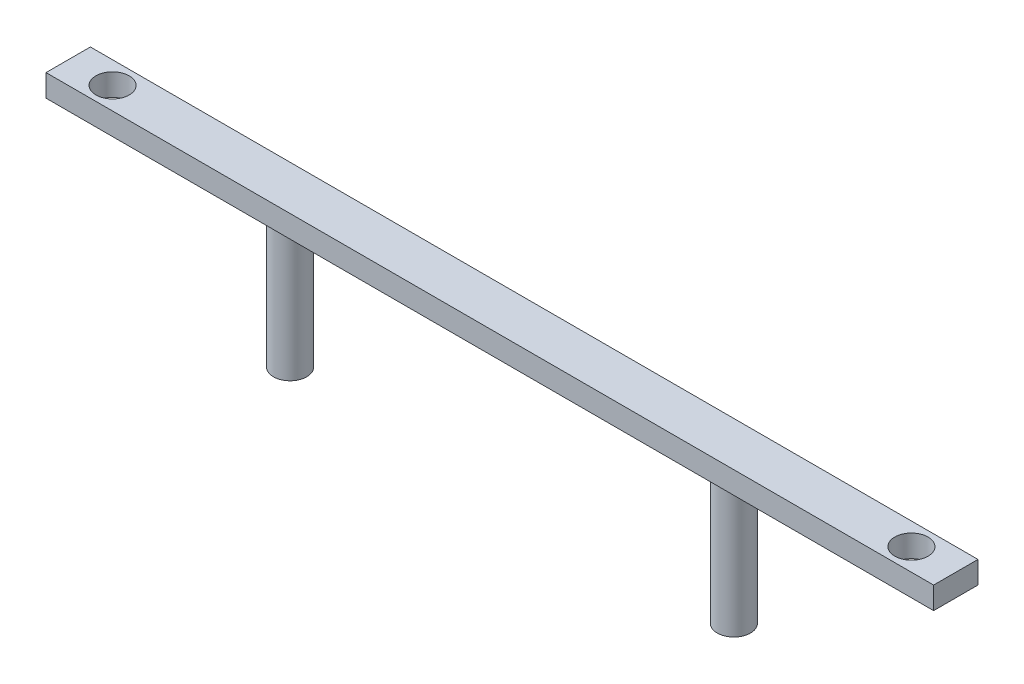
ISO-10303-21;
HEADER;
FILE_DESCRIPTION(('STEP AP214'),'2;1');
FILE_NAME('part.step','',(''),(''),'','','');
FILE_SCHEMA(('AUTOMOTIVE_DESIGN { 1 0 10303 214 1 1 1 1 }'));
ENDSEC;
DATA;
#1=APPLICATION_CONTEXT('core data for automotive mechanical design processes');
#2=APPLICATION_PROTOCOL_DEFINITION('international standard','automotive_design',2000,#1);
#3=PRODUCT_CONTEXT('',#1,'mechanical');
#4=PRODUCT('Part','Part','',(#3));
#5=PRODUCT_RELATED_PRODUCT_CATEGORY('part','',(#4));
#6=PRODUCT_DEFINITION_FORMATION('','',#4);
#7=PRODUCT_DEFINITION_CONTEXT('part definition',#1,'design');
#8=PRODUCT_DEFINITION('design','',#6,#7);
#9=PRODUCT_DEFINITION_SHAPE('','',#8);
#10=(LENGTH_UNIT() NAMED_UNIT(*) SI_UNIT(.MILLI.,.METRE.));
#11=(NAMED_UNIT(*) PLANE_ANGLE_UNIT() SI_UNIT($,.RADIAN.));
#12=(NAMED_UNIT(*) SI_UNIT($,.STERADIAN.) SOLID_ANGLE_UNIT());
#13=UNCERTAINTY_MEASURE_WITH_UNIT(LENGTH_MEASURE(1.E-05),#10,'distance_accuracy_value','');
#14=(GEOMETRIC_REPRESENTATION_CONTEXT(3) GLOBAL_UNCERTAINTY_ASSIGNED_CONTEXT((#13)) GLOBAL_UNIT_ASSIGNED_CONTEXT((#10,
#11,#12)) REPRESENTATION_CONTEXT('',''));
#15=CARTESIAN_POINT('',(0.,0.,0.));
#16=DIRECTION('',(0.,0.,1.));
#17=DIRECTION('',(1.,0.,0.));
#18=AXIS2_PLACEMENT_3D('',#15,#16,#17);
#19=CARTESIAN_POINT('',(254.,12.7,-12.7));
#20=DIRECTION('',(-1.,0.,0.));
#21=DIRECTION('',(0.,0.,1.));
#22=AXIS2_PLACEMENT_3D('',#19,#20,#21);
#23=PLANE('',#22);
#24=DIRECTION('',(0.,0.,-1.));
#25=VECTOR('',#24,1.);
#26=CARTESIAN_POINT('',(254.,0.,-12.7));
#27=LINE('',#26,#25);
#28=CARTESIAN_POINT('',(254.,0.,12.7));
#29=VERTEX_POINT('',#28);
#30=CARTESIAN_POINT('',(254.,0.,-12.7));
#31=VERTEX_POINT('',#30);
#32=EDGE_CURVE('E103',#29,#31,#27,.T.);
#33=ORIENTED_EDGE('',*,*,#32,.T.);
#34=DIRECTION('',(0.,-1.,0.));
#35=VECTOR('',#34,1.);
#36=CARTESIAN_POINT('',(254.,12.7,-12.7));
#37=LINE('',#36,#35);
#38=CARTESIAN_POINT('',(254.,12.7,-12.7));
#39=VERTEX_POINT('',#38);
#40=EDGE_CURVE('E94',#39,#31,#37,.T.);
#41=ORIENTED_EDGE('',*,*,#40,.F.);
#42=DIRECTION('',(0.,0.,-1.));
#43=VECTOR('',#42,1.);
#44=CARTESIAN_POINT('',(254.,12.7,-12.7));
#45=LINE('',#44,#43);
#46=CARTESIAN_POINT('',(254.,12.7,12.7));
#47=VERTEX_POINT('',#46);
#48=EDGE_CURVE('E88',#47,#39,#45,.T.);
#49=ORIENTED_EDGE('',*,*,#48,.F.);
#50=DIRECTION('',(0.,-1.,0.));
#51=VECTOR('',#50,1.);
#52=CARTESIAN_POINT('',(254.,12.7,12.7));
#53=LINE('',#52,#51);
#54=EDGE_CURVE('E99',#47,#29,#53,.T.);
#55=ORIENTED_EDGE('',*,*,#54,.T.);
#56=EDGE_LOOP('',(#33,#41,#49,#55));
#57=FACE_BOUND('',#56,.T.);
#58=ADVANCED_FACE('F36',(#57),#23,.F.);
#59=CARTESIAN_POINT('',(-254.,12.7,-12.7));
#60=DIRECTION('',(0.,0.,1.));
#61=DIRECTION('',(1.,0.,0.));
#62=AXIS2_PLACEMENT_3D('',#59,#60,#61);
#63=PLANE('',#62);
#64=DIRECTION('',(-1.,0.,0.));
#65=VECTOR('',#64,1.);
#66=CARTESIAN_POINT('',(-254.,0.,-12.7));
#67=LINE('',#66,#65);
#68=CARTESIAN_POINT('',(-254.,0.,-12.7));
#69=VERTEX_POINT('',#68);
#70=EDGE_CURVE('E93',#31,#69,#67,.T.);
#71=ORIENTED_EDGE('',*,*,#70,.T.);
#72=DIRECTION('',(0.,-1.,0.));
#73=VECTOR('',#72,1.);
#74=CARTESIAN_POINT('',(-254.,12.7,-12.7));
#75=LINE('',#74,#73);
#76=CARTESIAN_POINT('',(-254.,12.7,-12.7));
#77=VERTEX_POINT('',#76);
#78=EDGE_CURVE('E91',#77,#69,#75,.T.);
#79=ORIENTED_EDGE('',*,*,#78,.F.);
#80=DIRECTION('',(-1.,0.,0.));
#81=VECTOR('',#80,1.);
#82=CARTESIAN_POINT('',(-254.,12.7,-12.7));
#83=LINE('',#82,#81);
#84=EDGE_CURVE('E83',#39,#77,#83,.T.);
#85=ORIENTED_EDGE('',*,*,#84,.F.);
#86=ORIENTED_EDGE('',*,*,#40,.T.);
#87=EDGE_LOOP('',(#71,#79,#85,#86));
#88=FACE_BOUND('',#87,.T.);
#89=ADVANCED_FACE('F92',(#88),#63,.F.);
#90=CARTESIAN_POINT('',(-254.,12.7,-12.7));
#91=DIRECTION('',(1.,0.,0.));
#92=DIRECTION('',(0.,0.,-1.));
#93=AXIS2_PLACEMENT_3D('',#90,#91,#92);
#94=PLANE('',#93);
#95=DIRECTION('',(0.,0.,1.));
#96=VECTOR('',#95,1.);
#97=CARTESIAN_POINT('',(-254.,0.,-12.7));
#98=LINE('',#97,#96);
#99=CARTESIAN_POINT('',(-254.,0.,12.7));
#100=VERTEX_POINT('',#99);
#101=EDGE_CURVE('E69',#69,#100,#98,.T.);
#102=ORIENTED_EDGE('',*,*,#101,.T.);
#103=DIRECTION('',(0.,-1.,0.));
#104=VECTOR('',#103,1.);
#105=CARTESIAN_POINT('',(-254.,12.7,12.7));
#106=LINE('',#105,#104);
#107=CARTESIAN_POINT('',(-254.,12.7,12.7));
#108=VERTEX_POINT('',#107);
#109=EDGE_CURVE('E95',#108,#100,#106,.T.);
#110=ORIENTED_EDGE('',*,*,#109,.F.);
#111=DIRECTION('',(0.,0.,1.));
#112=VECTOR('',#111,1.);
#113=CARTESIAN_POINT('',(-254.,12.7,-12.7));
#114=LINE('',#113,#112);
#115=EDGE_CURVE('E86',#77,#108,#114,.T.);
#116=ORIENTED_EDGE('',*,*,#115,.F.);
#117=ORIENTED_EDGE('',*,*,#78,.T.);
#118=EDGE_LOOP('',(#102,#110,#116,#117));
#119=FACE_BOUND('',#118,.T.);
#120=ADVANCED_FACE('F97',(#119),#94,.F.);
#121=CARTESIAN_POINT('',(-254.,12.7,12.7));
#122=DIRECTION('',(0.,0.,-1.));
#123=DIRECTION('',(-1.,0.,0.));
#124=AXIS2_PLACEMENT_3D('',#121,#122,#123);
#125=PLANE('',#124);
#126=DIRECTION('',(1.,0.,0.));
#127=VECTOR('',#126,1.);
#128=CARTESIAN_POINT('',(-254.,0.,12.7));
#129=LINE('',#128,#127);
#130=EDGE_CURVE('E75',#100,#29,#129,.T.);
#131=ORIENTED_EDGE('',*,*,#130,.T.);
#132=ORIENTED_EDGE('',*,*,#54,.F.);
#133=DIRECTION('',(1.,0.,0.));
#134=VECTOR('',#133,1.);
#135=CARTESIAN_POINT('',(-254.,12.7,12.7));
#136=LINE('',#135,#134);
#137=EDGE_CURVE('E52',#108,#47,#136,.T.);
#138=ORIENTED_EDGE('',*,*,#137,.F.);
#139=ORIENTED_EDGE('',*,*,#109,.T.);
#140=EDGE_LOOP('',(#131,#132,#138,#139));
#141=FACE_BOUND('',#140,.T.);
#142=ADVANCED_FACE('F132',(#141),#125,.F.);
#143=CARTESIAN_POINT('',(0.,12.7,0.));
#144=DIRECTION('',(0.,1.,0.));
#145=DIRECTION('',(0.,0.,1.));
#146=AXIS2_PLACEMENT_3D('',#143,#144,#145);
#147=PLANE('',#146);
#148=CARTESIAN_POINT('',(-228.6,12.7,0.));
#149=DIRECTION('',(0.,1.,0.));
#150=DIRECTION('',(0.,0.,1.));
#151=AXIS2_PLACEMENT_3D('',#148,#149,#150);
#152=CIRCLE('',#151,9.52500000000002);
#153=CARTESIAN_POINT('',(-228.6,12.7,9.52500000000003));
#154=VERTEX_POINT('',#153);
#155=EDGE_CURVE('E240',#154,#154,#152,.T.);
#156=ORIENTED_EDGE('',*,*,#155,.F.);
#157=EDGE_LOOP('',(#156));
#158=FACE_BOUND('',#157,.T.);
#159=CARTESIAN_POINT('',(228.6,12.7,0.));
#160=DIRECTION('',(0.,1.,0.));
#161=DIRECTION('',(0.,0.,-1.));
#162=AXIS2_PLACEMENT_3D('',#159,#160,#161);
#163=CIRCLE('',#162,9.52500000000002);
#164=CARTESIAN_POINT('',(228.6,12.7,-9.52500000000002));
#165=VERTEX_POINT('',#164);
#166=EDGE_CURVE('E236',#165,#165,#163,.T.);
#167=ORIENTED_EDGE('',*,*,#166,.F.);
#168=EDGE_LOOP('',(#167));
#169=FACE_BOUND('',#168,.T.);
#170=ORIENTED_EDGE('',*,*,#48,.T.);
#171=ORIENTED_EDGE('',*,*,#84,.T.);
#172=ORIENTED_EDGE('',*,*,#115,.T.);
#173=ORIENTED_EDGE('',*,*,#137,.T.);
#174=EDGE_LOOP('',(#170,#171,#172,#173));
#175=FACE_BOUND('',#174,.T.);
#176=ADVANCED_FACE('F84',(#158,#169,#175),#147,.T.);
#177=CARTESIAN_POINT('',(0.,0.,0.));
#178=DIRECTION('',(0.,1.,0.));
#179=DIRECTION('',(0.,0.,1.));
#180=AXIS2_PLACEMENT_3D('',#177,#178,#179);
#181=PLANE('',#180);
#182=CARTESIAN_POINT('',(127.,0.,0.));
#183=DIRECTION('',(0.,1.,0.));
#184=DIRECTION('',(0.,0.,1.));
#185=AXIS2_PLACEMENT_3D('',#182,#183,#184);
#186=CIRCLE('',#185,9.52500000000001);
#187=CARTESIAN_POINT('',(127.,0.,9.52500000000001));
#188=VERTEX_POINT('',#187);
#189=EDGE_CURVE('E11',#188,#188,#186,.F.);
#190=ORIENTED_EDGE('',*,*,#189,.F.);
#191=EDGE_LOOP('',(#190));
#192=FACE_BOUND('',#191,.T.);
#193=CARTESIAN_POINT('',(-127.,0.,0.));
#194=DIRECTION('',(0.,1.,0.));
#195=DIRECTION('',(0.,0.,1.));
#196=AXIS2_PLACEMENT_3D('',#193,#194,#195);
#197=CIRCLE('',#196,9.52500000000001);
#198=CARTESIAN_POINT('',(-127.,0.,9.52500000000001));
#199=VERTEX_POINT('',#198);
#200=EDGE_CURVE('E44',#199,#199,#197,.F.);
#201=ORIENTED_EDGE('',*,*,#200,.F.);
#202=EDGE_LOOP('',(#201));
#203=FACE_BOUND('',#202,.T.);
#204=CARTESIAN_POINT('',(-228.6,0.,0.));
#205=DIRECTION('',(0.,1.,0.));
#206=DIRECTION('',(0.,0.,1.));
#207=AXIS2_PLACEMENT_3D('',#204,#205,#206);
#208=CIRCLE('',#207,9.52500000000002);
#209=CARTESIAN_POINT('',(-228.6,0.,9.52500000000003));
#210=VERTEX_POINT('',#209);
#211=EDGE_CURVE('E106',#210,#210,#208,.T.);
#212=ORIENTED_EDGE('',*,*,#211,.T.);
#213=EDGE_LOOP('',(#212));
#214=FACE_BOUND('',#213,.T.);
#215=CARTESIAN_POINT('',(228.6,0.,0.));
#216=DIRECTION('',(0.,1.,0.));
#217=DIRECTION('',(0.,0.,-1.));
#218=AXIS2_PLACEMENT_3D('',#215,#216,#217);
#219=CIRCLE('',#218,9.52500000000002);
#220=CARTESIAN_POINT('',(228.6,0.,-9.52500000000002));
#221=VERTEX_POINT('',#220);
#222=EDGE_CURVE('E129',#221,#221,#219,.T.);
#223=ORIENTED_EDGE('',*,*,#222,.T.);
#224=EDGE_LOOP('',(#223));
#225=FACE_BOUND('',#224,.T.);
#226=ORIENTED_EDGE('',*,*,#32,.F.);
#227=ORIENTED_EDGE('',*,*,#130,.F.);
#228=ORIENTED_EDGE('',*,*,#101,.F.);
#229=ORIENTED_EDGE('',*,*,#70,.F.);
#230=EDGE_LOOP('',(#226,#227,#228,#229));
#231=FACE_BOUND('',#230,.T.);
#232=ADVANCED_FACE('F117',(#192,#203,#214,#225,#231),#181,.F.);
#233=CARTESIAN_POINT('',(228.6,0.,0.));
#234=DIRECTION('',(0.,1.,0.));
#235=DIRECTION('',(0.,0.,1.));
#236=AXIS2_PLACEMENT_3D('',#233,#234,#235);
#237=CYLINDRICAL_SURFACE('',#236,9.52500000000002);
#238=ORIENTED_EDGE('',*,*,#222,.F.);
#239=EDGE_LOOP('',(#238));
#240=FACE_BOUND('',#239,.T.);
#241=ORIENTED_EDGE('',*,*,#166,.T.);
#242=EDGE_LOOP('',(#241));
#243=FACE_BOUND('',#242,.T.);
#244=ADVANCED_FACE('F120',(#240,#243),#237,.F.);
#245=CARTESIAN_POINT('',(-228.6,0.,0.));
#246=DIRECTION('',(0.,1.,0.));
#247=DIRECTION('',(0.,0.,1.));
#248=AXIS2_PLACEMENT_3D('',#245,#246,#247);
#249=CYLINDRICAL_SURFACE('',#248,9.52500000000002);
#250=ORIENTED_EDGE('',*,*,#211,.F.);
#251=EDGE_LOOP('',(#250));
#252=FACE_BOUND('',#251,.T.);
#253=ORIENTED_EDGE('',*,*,#155,.T.);
#254=EDGE_LOOP('',(#253));
#255=FACE_BOUND('',#254,.T.);
#256=ADVANCED_FACE('F172',(#252,#255),#249,.F.);
#257=CARTESIAN_POINT('',(-127.,-76.2,0.));
#258=DIRECTION('',(0.,1.,0.));
#259=DIRECTION('',(0.,0.,1.));
#260=AXIS2_PLACEMENT_3D('',#257,#258,#259);
#261=CYLINDRICAL_SURFACE('',#260,9.52500000000001);
#262=CARTESIAN_POINT('',(-127.,-76.2,0.));
#263=DIRECTION('',(0.,-1.,0.));
#264=DIRECTION('',(0.,0.,-1.));
#265=AXIS2_PLACEMENT_3D('',#262,#263,#264);
#266=CIRCLE('',#265,9.52500000000001);
#267=CARTESIAN_POINT('',(-127.,-76.2,9.52500000000001));
#268=VERTEX_POINT('',#267);
#269=EDGE_CURVE('E233',#268,#268,#266,.T.);
#270=CARTESIAN_POINT('',(-127.,-76.2,9.52500000000001));
#271=CARTESIAN_POINT('',(-127.,-75.40625,9.52500000000001));
#272=CARTESIAN_POINT('',(-127.,-74.6125,9.52500000000001));
#273=CARTESIAN_POINT('',(-127.,-73.025,9.52500000000001));
#274=CARTESIAN_POINT('',(-127.,-72.23125,9.52500000000001));
#275=CARTESIAN_POINT('',(-127.,-70.64375,9.52500000000001));
#276=CARTESIAN_POINT('',(-127.,-69.85,9.52500000000001));
#277=CARTESIAN_POINT('',(-127.,-68.2625,9.52500000000001));
#278=CARTESIAN_POINT('',(-127.,-67.46875,9.52500000000001));
#279=CARTESIAN_POINT('',(-127.,-65.88125,9.52500000000001));
#280=CARTESIAN_POINT('',(-127.,-65.0875,9.52500000000001));
#281=CARTESIAN_POINT('',(-127.,-63.5,9.52500000000001));
#282=CARTESIAN_POINT('',(-127.,-62.70625,9.52500000000001));
#283=CARTESIAN_POINT('',(-127.,-61.11875,9.52500000000001));
#284=CARTESIAN_POINT('',(-127.,-60.325,9.52500000000001));
#285=CARTESIAN_POINT('',(-127.,-58.7375,9.52500000000001));
#286=CARTESIAN_POINT('',(-127.,-57.94375,9.52500000000001));
#287=CARTESIAN_POINT('',(-127.,-56.35625,9.52500000000001));
#288=CARTESIAN_POINT('',(-127.,-55.5625,9.52500000000001));
#289=CARTESIAN_POINT('',(-127.,-53.975,9.52500000000001));
#290=CARTESIAN_POINT('',(-127.,-53.18125,9.52500000000001));
#291=CARTESIAN_POINT('',(-127.,-51.59375,9.52500000000001));
#292=CARTESIAN_POINT('',(-127.,-50.8,9.52500000000001));
#293=CARTESIAN_POINT('',(-127.,-49.2125,9.52500000000001));
#294=CARTESIAN_POINT('',(-127.,-48.41875,9.52500000000001));
#295=CARTESIAN_POINT('',(-127.,-46.83125,9.52500000000001));
#296=CARTESIAN_POINT('',(-127.,-46.0375,9.52500000000001));
#297=CARTESIAN_POINT('',(-127.,-44.45,9.52500000000001));
#298=CARTESIAN_POINT('',(-127.,-43.65625,9.52500000000001));
#299=CARTESIAN_POINT('',(-127.,-42.06875,9.52500000000001));
#300=CARTESIAN_POINT('',(-127.,-41.275,9.52500000000001));
#301=CARTESIAN_POINT('',(-127.,-39.6875,9.52500000000001));
#302=CARTESIAN_POINT('',(-127.,-38.89375,9.52500000000001));
#303=CARTESIAN_POINT('',(-127.,-37.30625,9.52500000000001));
#304=CARTESIAN_POINT('',(-127.,-36.5125,9.52500000000001));
#305=CARTESIAN_POINT('',(-127.,-34.925,9.52500000000001));
#306=CARTESIAN_POINT('',(-127.,-34.13125,9.52500000000001));
#307=CARTESIAN_POINT('',(-127.,-32.54375,9.52500000000001));
#308=CARTESIAN_POINT('',(-127.,-31.75,9.52500000000001));
#309=CARTESIAN_POINT('',(-127.,-30.1625,9.52500000000001));
#310=CARTESIAN_POINT('',(-127.,-29.36875,9.52500000000001));
#311=CARTESIAN_POINT('',(-127.,-27.78125,9.52500000000001));
#312=CARTESIAN_POINT('',(-127.,-26.9875,9.52500000000001));
#313=CARTESIAN_POINT('',(-127.,-25.4,9.52500000000001));
#314=CARTESIAN_POINT('',(-127.,-24.60625,9.52500000000001));
#315=CARTESIAN_POINT('',(-127.,-23.01875,9.52500000000001));
#316=CARTESIAN_POINT('',(-127.,-22.225,9.52500000000001));
#317=CARTESIAN_POINT('',(-127.,-20.6375,9.52500000000001));
#318=CARTESIAN_POINT('',(-127.,-19.84375,9.52500000000001));
#319=CARTESIAN_POINT('',(-127.,-18.25625,9.52500000000001));
#320=CARTESIAN_POINT('',(-127.,-17.4625,9.52500000000001));
#321=CARTESIAN_POINT('',(-127.,-15.875,9.52500000000001));
#322=CARTESIAN_POINT('',(-127.,-15.08125,9.52500000000001));
#323=CARTESIAN_POINT('',(-127.,-13.49375,9.52500000000001));
#324=CARTESIAN_POINT('',(-127.,-12.7,9.52500000000001));
#325=CARTESIAN_POINT('',(-127.,-11.1125,9.52500000000001));
#326=CARTESIAN_POINT('',(-127.,-10.31875,9.52500000000001));
#327=CARTESIAN_POINT('',(-127.,-8.73125,9.52500000000001));
#328=CARTESIAN_POINT('',(-127.,-7.93750000000001,9.52500000000001));
#329=CARTESIAN_POINT('',(-127.,-6.35,9.52500000000001));
#330=CARTESIAN_POINT('',(-127.,-5.55625,9.52500000000001));
#331=CARTESIAN_POINT('',(-127.,-3.96875,9.52500000000001));
#332=CARTESIAN_POINT('',(-127.,-3.175,9.52500000000001));
#333=CARTESIAN_POINT('',(-127.,-1.5875,9.52500000000001));
#334=CARTESIAN_POINT('',(-127.,-0.793750000000001,9.52500000000001));
#335=CARTESIAN_POINT('',(-127.,0.,9.52500000000001));
#336=B_SPLINE_CURVE_WITH_KNOTS('',3,(#270,#271,#272,#273,#274,#275,#276,#277,#278,#279,#280,
#281,#282,#283,#284,#285,#286,#287,#288,#289,#290,#291,#292,#293,#294,#295,#296,#297,#298,#299,
#300,#301,#302,#303,#304,#305,#306,#307,#308,#309,#310,#311,#312,#313,#314,#315,#316,#317,#318,
#319,#320,#321,#322,#323,#324,#325,#326,#327,#328,#329,#330,#331,#332,#333,#334,#335),
.UNSPECIFIED.,.F.,.F.,(4,2,2,2,2,2,2,2,2,2,2,2,2,2,2,2,2,2,2,2,2,2,2,2,2,2,2,2,2,2,2,2,4),(0.,
2.38125,4.7625,7.14375,9.52500000000001,11.90625,14.2875,16.66875,19.05,21.43125,23.8125,
26.19375,28.575,30.95625,33.3375,35.71875,38.1,40.48125,42.8625,45.24375,47.625,50.00625,
52.3875,54.76875,57.15,59.53125,61.9125,64.29375,66.675,69.05625,71.4375,73.81875,76.2),.UNSPECIFIED.);
#337=EDGE_CURVE('BSEAM115',#268,#199,#336,.T.);
#338=ORIENTED_EDGE('',*,*,#269,.F.);
#339=ORIENTED_EDGE('',*,*,#200,.T.);
#340=ORIENTED_EDGE('',*,*,#337,.T.);
#341=ORIENTED_EDGE('',*,*,#337,.F.);
#342=EDGE_LOOP('',(#338,#340,#339,#341));
#343=FACE_BOUND('',#342,.T.);
#344=ADVANCED_FACE('F115',(#343),#261,.T.);
#345=CARTESIAN_POINT('',(-127.,-76.2,0.));
#346=DIRECTION('',(0.,-1.,0.));
#347=DIRECTION('',(0.,0.,-1.));
#348=AXIS2_PLACEMENT_3D('',#345,#346,#347);
#349=PLANE('',#348);
#350=ORIENTED_EDGE('',*,*,#269,.T.);
#351=EDGE_LOOP('',(#350));
#352=FACE_BOUND('',#351,.T.);
#353=ADVANCED_FACE('F196',(#352),#349,.T.);
#354=CARTESIAN_POINT('',(127.,-76.2,0.));
#355=DIRECTION('',(0.,1.,0.));
#356=DIRECTION('',(0.,0.,1.));
#357=AXIS2_PLACEMENT_3D('',#354,#355,#356);
#358=CYLINDRICAL_SURFACE('',#357,9.52500000000001);
#359=CARTESIAN_POINT('',(127.,-76.2,0.));
#360=DIRECTION('',(0.,-1.,0.));
#361=DIRECTION('',(0.,0.,1.));
#362=AXIS2_PLACEMENT_3D('',#359,#360,#361);
#363=CIRCLE('',#362,9.52500000000001);
#364=CARTESIAN_POINT('',(127.,-76.2,9.52500000000001));
#365=VERTEX_POINT('',#364);
#366=EDGE_CURVE('E232',#365,#365,#363,.T.);
#367=CARTESIAN_POINT('',(127.,-76.2,9.52500000000001));
#368=CARTESIAN_POINT('',(127.,-75.40625,9.52500000000001));
#369=CARTESIAN_POINT('',(127.,-74.6125,9.52500000000001));
#370=CARTESIAN_POINT('',(127.,-73.025,9.52500000000001));
#371=CARTESIAN_POINT('',(127.,-72.23125,9.52500000000001));
#372=CARTESIAN_POINT('',(127.,-70.64375,9.52500000000001));
#373=CARTESIAN_POINT('',(127.,-69.85,9.52500000000001));
#374=CARTESIAN_POINT('',(127.,-68.2625,9.52500000000001));
#375=CARTESIAN_POINT('',(127.,-67.46875,9.52500000000001));
#376=CARTESIAN_POINT('',(127.,-65.88125,9.52500000000001));
#377=CARTESIAN_POINT('',(127.,-65.0875,9.52500000000001));
#378=CARTESIAN_POINT('',(127.,-63.5,9.52500000000001));
#379=CARTESIAN_POINT('',(127.,-62.70625,9.52500000000001));
#380=CARTESIAN_POINT('',(127.,-61.11875,9.52500000000001));
#381=CARTESIAN_POINT('',(127.,-60.325,9.52500000000001));
#382=CARTESIAN_POINT('',(127.,-58.7375,9.52500000000001));
#383=CARTESIAN_POINT('',(127.,-57.94375,9.52500000000001));
#384=CARTESIAN_POINT('',(127.,-56.35625,9.52500000000001));
#385=CARTESIAN_POINT('',(127.,-55.5625,9.52500000000001));
#386=CARTESIAN_POINT('',(127.,-53.975,9.52500000000001));
#387=CARTESIAN_POINT('',(127.,-53.18125,9.52500000000001));
#388=CARTESIAN_POINT('',(127.,-51.59375,9.52500000000001));
#389=CARTESIAN_POINT('',(127.,-50.8,9.52500000000001));
#390=CARTESIAN_POINT('',(127.,-49.2125,9.52500000000001));
#391=CARTESIAN_POINT('',(127.,-48.41875,9.52500000000001));
#392=CARTESIAN_POINT('',(127.,-46.83125,9.52500000000001));
#393=CARTESIAN_POINT('',(127.,-46.0375,9.52500000000001));
#394=CARTESIAN_POINT('',(127.,-44.45,9.52500000000001));
#395=CARTESIAN_POINT('',(127.,-43.65625,9.52500000000001));
#396=CARTESIAN_POINT('',(127.,-42.06875,9.52500000000001));
#397=CARTESIAN_POINT('',(127.,-41.275,9.52500000000001));
#398=CARTESIAN_POINT('',(127.,-39.6875,9.52500000000001));
#399=CARTESIAN_POINT('',(127.,-38.89375,9.52500000000001));
#400=CARTESIAN_POINT('',(127.,-37.30625,9.52500000000001));
#401=CARTESIAN_POINT('',(127.,-36.5125,9.52500000000001));
#402=CARTESIAN_POINT('',(127.,-34.925,9.52500000000001));
#403=CARTESIAN_POINT('',(127.,-34.13125,9.52500000000001));
#404=CARTESIAN_POINT('',(127.,-32.54375,9.52500000000001));
#405=CARTESIAN_POINT('',(127.,-31.75,9.52500000000001));
#406=CARTESIAN_POINT('',(127.,-30.1625,9.52500000000001));
#407=CARTESIAN_POINT('',(127.,-29.36875,9.52500000000001));
#408=CARTESIAN_POINT('',(127.,-27.78125,9.52500000000001));
#409=CARTESIAN_POINT('',(127.,-26.9875,9.52500000000001));
#410=CARTESIAN_POINT('',(127.,-25.4,9.52500000000001));
#411=CARTESIAN_POINT('',(127.,-24.60625,9.52500000000001));
#412=CARTESIAN_POINT('',(127.,-23.01875,9.52500000000001));
#413=CARTESIAN_POINT('',(127.,-22.225,9.52500000000001));
#414=CARTESIAN_POINT('',(127.,-20.6375,9.52500000000001));
#415=CARTESIAN_POINT('',(127.,-19.84375,9.52500000000001));
#416=CARTESIAN_POINT('',(127.,-18.25625,9.52500000000001));
#417=CARTESIAN_POINT('',(127.,-17.4625,9.52500000000001));
#418=CARTESIAN_POINT('',(127.,-15.875,9.52500000000001));
#419=CARTESIAN_POINT('',(127.,-15.08125,9.52500000000001));
#420=CARTESIAN_POINT('',(127.,-13.49375,9.52500000000001));
#421=CARTESIAN_POINT('',(127.,-12.7,9.52500000000001));
#422=CARTESIAN_POINT('',(127.,-11.1125,9.52500000000001));
#423=CARTESIAN_POINT('',(127.,-10.31875,9.52500000000001));
#424=CARTESIAN_POINT('',(127.,-8.73125,9.52500000000001));
#425=CARTESIAN_POINT('',(127.,-7.93750000000001,9.52500000000001));
#426=CARTESIAN_POINT('',(127.,-6.35,9.52500000000001));
#427=CARTESIAN_POINT('',(127.,-5.55625,9.52500000000001));
#428=CARTESIAN_POINT('',(127.,-3.96875,9.52500000000001));
#429=CARTESIAN_POINT('',(127.,-3.175,9.52500000000001));
#430=CARTESIAN_POINT('',(127.,-1.5875,9.52500000000001));
#431=CARTESIAN_POINT('',(127.,-0.793750000000001,9.52500000000001));
#432=CARTESIAN_POINT('',(127.,0.,9.52500000000001));
#433=B_SPLINE_CURVE_WITH_KNOTS('',3,(#367,#368,#369,#370,#371,#372,#373,#374,#375,#376,#377,
#378,#379,#380,#381,#382,#383,#384,#385,#386,#387,#388,#389,#390,#391,#392,#393,#394,#395,#396,
#397,#398,#399,#400,#401,#402,#403,#404,#405,#406,#407,#408,#409,#410,#411,#412,#413,#414,#415,
#416,#417,#418,#419,#420,#421,#422,#423,#424,#425,#426,#427,#428,#429,#430,#431,#432),
.UNSPECIFIED.,.F.,.F.,(4,2,2,2,2,2,2,2,2,2,2,2,2,2,2,2,2,2,2,2,2,2,2,2,2,2,2,2,2,2,2,2,4),(0.,
2.38125,4.7625,7.14375,9.52500000000001,11.90625,14.2875,16.66875,19.05,21.43125,23.8125,
26.19375,28.575,30.95625,33.3375,35.71875,38.1,40.48125,42.8625,45.24375,47.625,50.00625,
52.3875,54.76875,57.15,59.53125,61.9125,64.29375,66.675,69.05625,71.4375,73.81875,76.2),.UNSPECIFIED.);
#434=EDGE_CURVE('BSEAM206',#365,#188,#433,.T.);
#435=ORIENTED_EDGE('',*,*,#366,.F.);
#436=ORIENTED_EDGE('',*,*,#189,.T.);
#437=ORIENTED_EDGE('',*,*,#434,.T.);
#438=ORIENTED_EDGE('',*,*,#434,.F.);
#439=EDGE_LOOP('',(#435,#437,#436,#438));
#440=FACE_BOUND('',#439,.T.);
#441=ADVANCED_FACE('F206',(#440),#358,.T.);
#442=CARTESIAN_POINT('',(127.,-76.2,0.));
#443=DIRECTION('',(0.,1.,0.));
#444=DIRECTION('',(0.,0.,1.));
#445=AXIS2_PLACEMENT_3D('',#442,#443,#444);
#446=PLANE('',#445);
#447=ORIENTED_EDGE('',*,*,#366,.T.);
#448=EDGE_LOOP('',(#447));
#449=FACE_BOUND('',#448,.T.);
#450=ADVANCED_FACE('F216',(#449),#446,.F.);
#451=CLOSED_SHELL('',(#58,#89,#120,#142,#176,#232,#244,#256,#344,#353,#441,#450));
#452=MANIFOLD_SOLID_BREP('B2',#451);
#453=ADVANCED_BREP_SHAPE_REPRESENTATION('',(#18,#452),#14);
#454=SHAPE_DEFINITION_REPRESENTATION(#9,#453);
ENDSEC;
END-ISO-10303-21;
